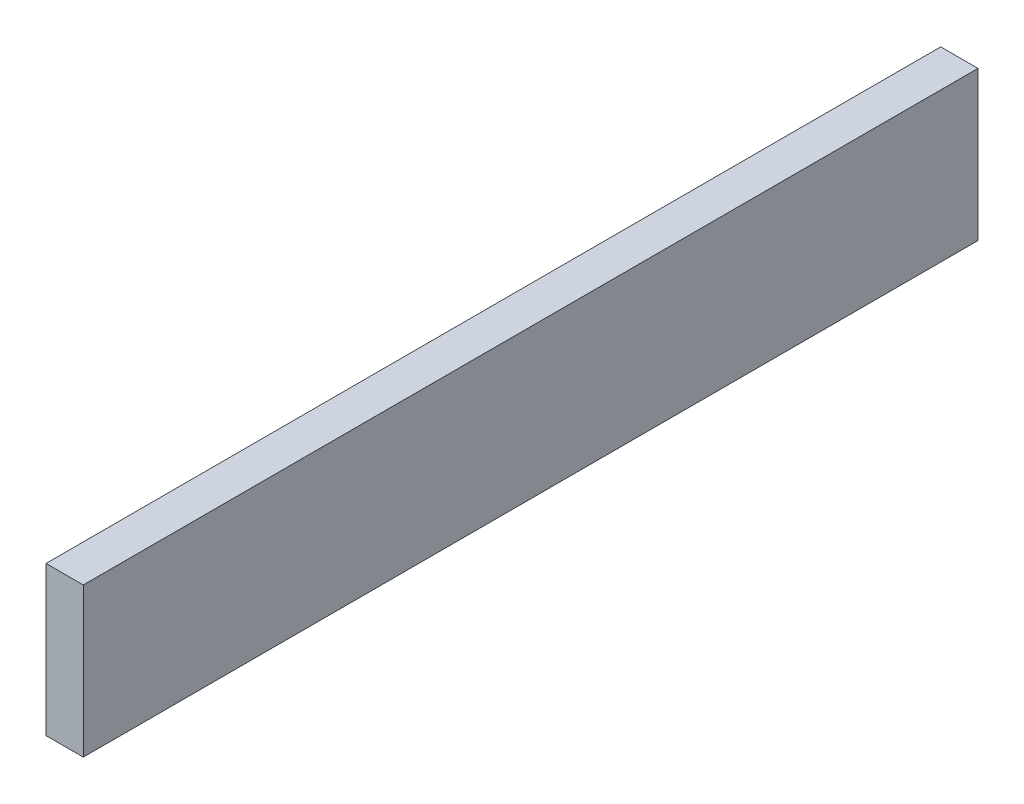
ISO-10303-21;
HEADER;
FILE_DESCRIPTION(('STEP AP214'),'2;1');
FILE_NAME('part.step','',(''),(''),'','','');
FILE_SCHEMA(('AUTOMOTIVE_DESIGN { 1 0 10303 214 1 1 1 1 }'));
ENDSEC;
DATA;
#1=APPLICATION_CONTEXT('core data for automotive mechanical design processes');
#2=APPLICATION_PROTOCOL_DEFINITION('international standard','automotive_design',2000,#1);
#3=PRODUCT_CONTEXT('',#1,'mechanical');
#4=PRODUCT('Part','Part','',(#3));
#5=PRODUCT_RELATED_PRODUCT_CATEGORY('part','',(#4));
#6=PRODUCT_DEFINITION_FORMATION('','',#4);
#7=PRODUCT_DEFINITION_CONTEXT('part definition',#1,'design');
#8=PRODUCT_DEFINITION('design','',#6,#7);
#9=PRODUCT_DEFINITION_SHAPE('','',#8);
#10=(LENGTH_UNIT() NAMED_UNIT(*) SI_UNIT(.MILLI.,.METRE.));
#11=(NAMED_UNIT(*) PLANE_ANGLE_UNIT() SI_UNIT($,.RADIAN.));
#12=(NAMED_UNIT(*) SI_UNIT($,.STERADIAN.) SOLID_ANGLE_UNIT());
#13=UNCERTAINTY_MEASURE_WITH_UNIT(LENGTH_MEASURE(1.E-05),#10,'distance_accuracy_value','');
#14=(GEOMETRIC_REPRESENTATION_CONTEXT(3) GLOBAL_UNCERTAINTY_ASSIGNED_CONTEXT((#13)) GLOBAL_UNIT_ASSIGNED_CONTEXT((#10,
#11,#12)) REPRESENTATION_CONTEXT('',''));
#15=CARTESIAN_POINT('',(0.,0.,0.));
#16=DIRECTION('',(0.,0.,1.));
#17=DIRECTION('',(1.,0.,0.));
#18=AXIS2_PLACEMENT_3D('',#15,#16,#17);
#19=CARTESIAN_POINT('',(3.175,-6.35,38.1));
#20=DIRECTION('',(0.,0.,-1.));
#21=DIRECTION('',(-1.,0.,0.));
#22=AXIS2_PLACEMENT_3D('',#19,#20,#21);
#23=PLANE('',#22);
#24=DIRECTION('',(0.,-1.,0.));
#25=VECTOR('',#24,1.);
#26=CARTESIAN_POINT('',(0.,-6.35,38.1));
#27=LINE('',#26,#25);
#28=CARTESIAN_POINT('',(0.,6.35,38.1));
#29=VERTEX_POINT('',#28);
#30=CARTESIAN_POINT('',(0.,-6.35,38.1));
#31=VERTEX_POINT('',#30);
#32=EDGE_CURVE('E96',#29,#31,#27,.T.);
#33=ORIENTED_EDGE('',*,*,#32,.T.);
#34=DIRECTION('',(-1.,0.,0.));
#35=VECTOR('',#34,1.);
#36=CARTESIAN_POINT('',(3.175,-6.35,38.1));
#37=LINE('',#36,#35);
#38=CARTESIAN_POINT('',(3.175,-6.35,38.1));
#39=VERTEX_POINT('',#38);
#40=EDGE_CURVE('E11',#39,#31,#37,.T.);
#41=ORIENTED_EDGE('',*,*,#40,.F.);
#42=DIRECTION('',(0.,-1.,0.));
#43=VECTOR('',#42,1.);
#44=CARTESIAN_POINT('',(3.175,-6.35,38.1));
#45=LINE('',#44,#43);
#46=CARTESIAN_POINT('',(3.175,6.35,38.1));
#47=VERTEX_POINT('',#46);
#48=EDGE_CURVE('E84',#47,#39,#45,.T.);
#49=ORIENTED_EDGE('',*,*,#48,.F.);
#50=DIRECTION('',(-1.,0.,0.));
#51=VECTOR('',#50,1.);
#52=CARTESIAN_POINT('',(3.175,6.35,38.1));
#53=LINE('',#52,#51);
#54=EDGE_CURVE('E92',#47,#29,#53,.T.);
#55=ORIENTED_EDGE('',*,*,#54,.T.);
#56=EDGE_LOOP('',(#33,#41,#49,#55));
#57=FACE_BOUND('',#56,.T.);
#58=ADVANCED_FACE('F33',(#57),#23,.F.);
#59=CARTESIAN_POINT('',(3.175,-6.34999999999999,-38.1));
#60=DIRECTION('',(0.,1.,0.));
#61=DIRECTION('',(0.,0.,1.));
#62=AXIS2_PLACEMENT_3D('',#59,#60,#61);
#63=PLANE('',#62);
#64=DIRECTION('',(0.,0.,-1.));
#65=VECTOR('',#64,1.);
#66=CARTESIAN_POINT('',(0.,-6.34999999999999,-38.1));
#67=LINE('',#66,#65);
#68=CARTESIAN_POINT('',(0.,-6.34999999999999,-38.1));
#69=VERTEX_POINT('',#68);
#70=EDGE_CURVE('E88',#31,#69,#67,.T.);
#71=ORIENTED_EDGE('',*,*,#70,.T.);
#72=DIRECTION('',(-1.,0.,0.));
#73=VECTOR('',#72,1.);
#74=CARTESIAN_POINT('',(3.175,-6.34999999999999,-38.1));
#75=LINE('',#74,#73);
#76=CARTESIAN_POINT('',(3.175,-6.34999999999999,-38.1));
#77=VERTEX_POINT('',#76);
#78=EDGE_CURVE('E41',#77,#69,#75,.T.);
#79=ORIENTED_EDGE('',*,*,#78,.F.);
#80=DIRECTION('',(0.,0.,-1.));
#81=VECTOR('',#80,1.);
#82=CARTESIAN_POINT('',(3.175,-6.34999999999999,-38.1));
#83=LINE('',#82,#81);
#84=EDGE_CURVE('E79',#39,#77,#83,.T.);
#85=ORIENTED_EDGE('',*,*,#84,.F.);
#86=ORIENTED_EDGE('',*,*,#40,.T.);
#87=EDGE_LOOP('',(#71,#79,#85,#86));
#88=FACE_BOUND('',#87,.T.);
#89=ADVANCED_FACE('F87',(#88),#63,.F.);
#90=CARTESIAN_POINT('',(3.175,-6.34999999999999,-38.1));
#91=DIRECTION('',(0.,0.,1.));
#92=DIRECTION('',(1.,0.,0.));
#93=AXIS2_PLACEMENT_3D('',#90,#91,#92);
#94=PLANE('',#93);
#95=DIRECTION('',(0.,1.,0.));
#96=VECTOR('',#95,1.);
#97=CARTESIAN_POINT('',(0.,-6.34999999999999,-38.1));
#98=LINE('',#97,#96);
#99=CARTESIAN_POINT('',(0.,6.35,-38.1));
#100=VERTEX_POINT('',#99);
#101=EDGE_CURVE('E66',#69,#100,#98,.T.);
#102=ORIENTED_EDGE('',*,*,#101,.T.);
#103=DIRECTION('',(-1.,0.,0.));
#104=VECTOR('',#103,1.);
#105=CARTESIAN_POINT('',(3.175,6.35,-38.1));
#106=LINE('',#105,#104);
#107=CARTESIAN_POINT('',(3.175,6.35,-38.1));
#108=VERTEX_POINT('',#107);
#109=EDGE_CURVE('E89',#108,#100,#106,.T.);
#110=ORIENTED_EDGE('',*,*,#109,.F.);
#111=DIRECTION('',(0.,1.,0.));
#112=VECTOR('',#111,1.);
#113=CARTESIAN_POINT('',(3.175,-6.34999999999999,-38.1));
#114=LINE('',#113,#112);
#115=EDGE_CURVE('E82',#77,#108,#114,.T.);
#116=ORIENTED_EDGE('',*,*,#115,.F.);
#117=ORIENTED_EDGE('',*,*,#78,.T.);
#118=EDGE_LOOP('',(#102,#110,#116,#117));
#119=FACE_BOUND('',#118,.T.);
#120=ADVANCED_FACE('F90',(#119),#94,.F.);
#121=CARTESIAN_POINT('',(3.175,6.35,-38.1));
#122=DIRECTION('',(0.,-1.,0.));
#123=DIRECTION('',(0.,0.,-1.));
#124=AXIS2_PLACEMENT_3D('',#121,#122,#123);
#125=PLANE('',#124);
#126=DIRECTION('',(0.,0.,1.));
#127=VECTOR('',#126,1.);
#128=CARTESIAN_POINT('',(0.,6.35,-38.1));
#129=LINE('',#128,#127);
#130=EDGE_CURVE('E72',#100,#29,#129,.T.);
#131=ORIENTED_EDGE('',*,*,#130,.T.);
#132=ORIENTED_EDGE('',*,*,#54,.F.);
#133=DIRECTION('',(0.,0.,1.));
#134=VECTOR('',#133,1.);
#135=CARTESIAN_POINT('',(3.175,6.35,-38.1));
#136=LINE('',#135,#134);
#137=EDGE_CURVE('E49',#108,#47,#136,.T.);
#138=ORIENTED_EDGE('',*,*,#137,.F.);
#139=ORIENTED_EDGE('',*,*,#109,.T.);
#140=EDGE_LOOP('',(#131,#132,#138,#139));
#141=FACE_BOUND('',#140,.T.);
#142=ADVANCED_FACE('F103',(#141),#125,.F.);
#143=CARTESIAN_POINT('',(3.175,0.,0.));
#144=DIRECTION('',(1.,0.,0.));
#145=DIRECTION('',(0.,0.,-1.));
#146=AXIS2_PLACEMENT_3D('',#143,#144,#145);
#147=PLANE('',#146);
#148=ORIENTED_EDGE('',*,*,#48,.T.);
#149=ORIENTED_EDGE('',*,*,#84,.T.);
#150=ORIENTED_EDGE('',*,*,#115,.T.);
#151=ORIENTED_EDGE('',*,*,#137,.T.);
#152=EDGE_LOOP('',(#148,#149,#150,#151));
#153=FACE_BOUND('',#152,.T.);
#154=ADVANCED_FACE('F80',(#153),#147,.T.);
#155=CARTESIAN_POINT('',(0.,0.,0.));
#156=DIRECTION('',(1.,0.,0.));
#157=DIRECTION('',(0.,0.,-1.));
#158=AXIS2_PLACEMENT_3D('',#155,#156,#157);
#159=PLANE('',#158);
#160=ORIENTED_EDGE('',*,*,#32,.F.);
#161=ORIENTED_EDGE('',*,*,#130,.F.);
#162=ORIENTED_EDGE('',*,*,#101,.F.);
#163=ORIENTED_EDGE('',*,*,#70,.F.);
#164=EDGE_LOOP('',(#160,#161,#162,#163));
#165=FACE_BOUND('',#164,.T.);
#166=ADVANCED_FACE('F106',(#165),#159,.F.);
#167=CLOSED_SHELL('',(#58,#89,#120,#142,#154,#166));
#168=MANIFOLD_SOLID_BREP('B2',#167);
#169=ADVANCED_BREP_SHAPE_REPRESENTATION('',(#18,#168),#14);
#170=SHAPE_DEFINITION_REPRESENTATION(#9,#169);
ENDSEC;
END-ISO-10303-21;
